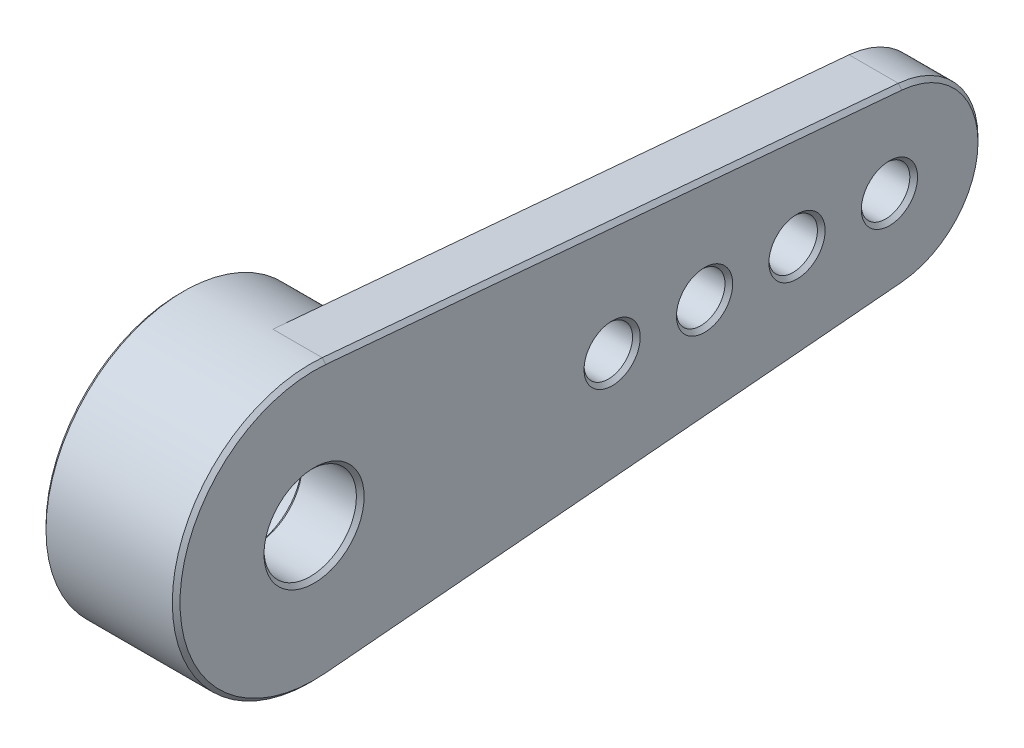
ISO-10303-21;
HEADER;
FILE_DESCRIPTION(('STEP AP214'),'2;1');
FILE_NAME('part.step','',(''),(''),'','','');
FILE_SCHEMA(('AUTOMOTIVE_DESIGN { 1 0 10303 214 1 1 1 1 }'));
ENDSEC;
DATA;
#1=APPLICATION_CONTEXT('core data for automotive mechanical design processes');
#2=APPLICATION_PROTOCOL_DEFINITION('international standard','automotive_design',2000,#1);
#3=PRODUCT_CONTEXT('',#1,'mechanical');
#4=PRODUCT('Part','Part','',(#3));
#5=PRODUCT_RELATED_PRODUCT_CATEGORY('part','',(#4));
#6=PRODUCT_DEFINITION_FORMATION('','',#4);
#7=PRODUCT_DEFINITION_CONTEXT('part definition',#1,'design');
#8=PRODUCT_DEFINITION('design','',#6,#7);
#9=PRODUCT_DEFINITION_SHAPE('','',#8);
#10=(LENGTH_UNIT() NAMED_UNIT(*) SI_UNIT(.MILLI.,.METRE.));
#11=(NAMED_UNIT(*) PLANE_ANGLE_UNIT() SI_UNIT($,.RADIAN.));
#12=(NAMED_UNIT(*) SI_UNIT($,.STERADIAN.) SOLID_ANGLE_UNIT());
#13=UNCERTAINTY_MEASURE_WITH_UNIT(LENGTH_MEASURE(1.E-05),#10,'distance_accuracy_value','');
#14=(GEOMETRIC_REPRESENTATION_CONTEXT(3) GLOBAL_UNCERTAINTY_ASSIGNED_CONTEXT((#13)) GLOBAL_UNIT_ASSIGNED_CONTEXT((#10,
#11,#12)) REPRESENTATION_CONTEXT('',''));
#15=CARTESIAN_POINT('',(0.,0.,0.));
#16=DIRECTION('',(0.,0.,1.));
#17=DIRECTION('',(1.,0.,0.));
#18=AXIS2_PLACEMENT_3D('',#15,#16,#17);
#19=CARTESIAN_POINT('',(0.167920724820396,0.,-7.68182563539887));
#20=DIRECTION('',(1.,0.,0.));
#21=DIRECTION('',(0.,0.,-1.));
#22=AXIS2_PLACEMENT_3D('',#19,#20,#21);
#23=PLANE('',#22);
#24=CARTESIAN_POINT('',(0.167920724820396,0.,-13.5797056353989));
#25=DIRECTION('',(1.,0.,0.));
#26=DIRECTION('',(0.,0.,-1.));
#27=AXIS2_PLACEMENT_3D('',#24,#25,#26);
#28=CIRCLE('',#27,0.556259999999997);
#29=CARTESIAN_POINT('',(0.167920724820396,0.,-14.1359656353989));
#30=VERTEX_POINT('',#29);
#31=EDGE_CURVE('E270',#30,#30,#28,.T.);
#32=ORIENTED_EDGE('',*,*,#31,.T.);
#33=EDGE_LOOP('',(#32));
#34=FACE_BOUND('',#33,.T.);
#35=CARTESIAN_POINT('',(0.167920724820396,0.,-15.4085056353989));
#36=DIRECTION('',(1.,0.,0.));
#37=DIRECTION('',(0.,0.,-1.));
#38=AXIS2_PLACEMENT_3D('',#35,#36,#37);
#39=CIRCLE('',#38,0.556259999999998);
#40=CARTESIAN_POINT('',(0.167920724820396,0.,-15.9647656353989));
#41=VERTEX_POINT('',#40);
#42=EDGE_CURVE('E267',#41,#41,#39,.T.);
#43=ORIENTED_EDGE('',*,*,#42,.T.);
#44=EDGE_LOOP('',(#43));
#45=FACE_BOUND('',#44,.T.);
#46=CARTESIAN_POINT('',(0.167920724820396,0.,-17.2373056353989));
#47=DIRECTION('',(1.,0.,0.));
#48=DIRECTION('',(0.,0.,-1.));
#49=AXIS2_PLACEMENT_3D('',#46,#47,#48);
#50=CIRCLE('',#49,0.556260000000002);
#51=CARTESIAN_POINT('',(0.167920724820396,0.,-17.7935656353989));
#52=VERTEX_POINT('',#51);
#53=EDGE_CURVE('E264',#52,#52,#50,.T.);
#54=ORIENTED_EDGE('',*,*,#53,.T.);
#55=EDGE_LOOP('',(#54));
#56=FACE_BOUND('',#55,.T.);
#57=CARTESIAN_POINT('',(0.167920724820396,0.,-19.0661056353989));
#58=DIRECTION('',(1.,0.,0.));
#59=DIRECTION('',(0.,0.,-1.));
#60=AXIS2_PLACEMENT_3D('',#57,#58,#59);
#61=CIRCLE('',#60,0.556259999999998);
#62=CARTESIAN_POINT('',(0.167920724820396,0.,-19.6223656353989));
#63=VERTEX_POINT('',#62);
#64=EDGE_CURVE('E261',#63,#63,#61,.T.);
#65=ORIENTED_EDGE('',*,*,#64,.T.);
#66=EDGE_LOOP('',(#65));
#67=FACE_BOUND('',#66,.T.);
#68=CARTESIAN_POINT('',(0.167920724820396,0.,-19.1680347194765));
#69=DIRECTION('',(1.,0.,0.));
#70=DIRECTION('',(0.,0.,-1.));
#71=AXIS2_PLACEMENT_3D('',#68,#69,#70);
#72=CIRCLE('',#71,1.6506709159224);
#73=CARTESIAN_POINT('',(0.167920724820396,1.64438961473614,-19.3119001691856));
#74=VERTEX_POINT('',#73);
#75=CARTESIAN_POINT('',(0.167920724820396,-1.64438961473614,-19.3119001691856));
#76=VERTEX_POINT('',#75);
#77=EDGE_CURVE('E215',#74,#76,#72,.F.);
#78=ORIENTED_EDGE('',*,*,#77,.T.);
#79=DIRECTION('',(0.,-0.0871557427476516,0.996194698091746));
#80=VECTOR('',#79,1.);
#81=CARTESIAN_POINT('',(0.167920724820396,-2.64166925261177,-7.91294174778738));
#82=LINE('',#81,#80);
#83=CARTESIAN_POINT('',(0.167920724820396,-2.58586679449233,-8.55076676271532));
#84=VERTEX_POINT('',#83);
#85=EDGE_CURVE('E200',#76,#84,#82,.T.);
#86=ORIENTED_EDGE('',*,*,#85,.T.);
#87=CARTESIAN_POINT('',(0.167920724820396,0.,-7.68182563539887));
#88=DIRECTION('',(-1.,0.,0.));
#89=DIRECTION('',(0.,0.,1.));
#90=AXIS2_PLACEMENT_3D('',#87,#88,#89);
#91=CIRCLE('',#90,2.72796);
#92=CARTESIAN_POINT('',(0.167920724820396,2.58586679449233,-8.55076676271532));
#93=VERTEX_POINT('',#92);
#94=EDGE_CURVE('E224',#93,#84,#91,.T.);
#95=ORIENTED_EDGE('',*,*,#94,.F.);
#96=DIRECTION('',(0.,-0.0871557427476513,-0.996194698091746));
#97=VECTOR('',#96,1.);
#98=CARTESIAN_POINT('',(0.167920724820396,1.64438961473614,-19.3119001691856));
#99=LINE('',#98,#97);
#100=EDGE_CURVE('E219',#93,#74,#99,.T.);
#101=ORIENTED_EDGE('',*,*,#100,.T.);
#102=EDGE_LOOP('',(#78,#86,#95,#101));
#103=FACE_BOUND('',#102,.T.);
#104=ADVANCED_FACE('F35',(#34,#45,#56,#67,#103),#23,.F.);
#105=CARTESIAN_POINT('',(-2.6057592751796,0.,-19.1680347194765));
#106=DIRECTION('',(1.,0.,0.));
#107=DIRECTION('',(0.,0.,-1.));
#108=AXIS2_PLACEMENT_3D('',#105,#106,#107);
#109=CYLINDRICAL_SURFACE('',#108,1.7268709159224);
#110=DIRECTION('',(1.,0.,0.));
#111=VECTOR('',#110,1.);
#112=CARTESIAN_POINT('',(-2.6057592751796,-1.72029965073073,-19.318541436783));
#113=LINE('',#112,#111);
#114=CARTESIAN_POINT('',(0.244120724820395,-1.72029965073073,-19.318541436783));
#115=VERTEX_POINT('',#114);
#116=CARTESIAN_POINT('',(1.2194807248204,-1.72029965073073,-19.318541436783));
#117=VERTEX_POINT('',#116);
#118=EDGE_CURVE('E184',#115,#117,#113,.T.);
#119=ORIENTED_EDGE('',*,*,#118,.F.);
#120=CARTESIAN_POINT('',(0.244120724820395,0.,-19.1680347194765));
#121=DIRECTION('',(1.,0.,0.));
#122=DIRECTION('',(0.,0.,-1.));
#123=AXIS2_PLACEMENT_3D('',#120,#121,#122);
#124=CIRCLE('',#123,1.7268709159224);
#125=CARTESIAN_POINT('',(0.244120724820395,1.72029965073073,-19.318541436783));
#126=VERTEX_POINT('',#125);
#127=EDGE_CURVE('E52',#115,#126,#124,.T.);
#128=ORIENTED_EDGE('',*,*,#127,.T.);
#129=DIRECTION('',(1.,0.,0.));
#130=VECTOR('',#129,1.);
#131=CARTESIAN_POINT('',(-2.6057592751796,1.72029965073073,-19.318541436783));
#132=LINE('',#131,#130);
#133=CARTESIAN_POINT('',(1.2194807248204,1.72029965073073,-19.318541436783));
#134=VERTEX_POINT('',#133);
#135=EDGE_CURVE('E199',#126,#134,#132,.T.);
#136=ORIENTED_EDGE('',*,*,#135,.T.);
#137=CARTESIAN_POINT('',(1.2194807248204,0.,-19.1680347194765));
#138=DIRECTION('',(1.,0.,0.));
#139=DIRECTION('',(0.,0.,-1.));
#140=AXIS2_PLACEMENT_3D('',#137,#138,#139);
#141=CIRCLE('',#140,1.7268709159224);
#142=EDGE_CURVE('E110',#134,#117,#141,.F.);
#143=ORIENTED_EDGE('',*,*,#142,.T.);
#144=EDGE_LOOP('',(#119,#128,#136,#143));
#145=FACE_BOUND('',#144,.T.);
#146=ADVANCED_FACE('F233',(#145),#109,.T.);
#147=CARTESIAN_POINT('',(-2.6057592751796,-2.71757928860636,-7.91958301538475));
#148=DIRECTION('',(0.,-0.996194698091746,-0.0871557427476516));
#149=DIRECTION('',(0.,0.0871557427476516,-0.996194698091746));
#150=AXIS2_PLACEMENT_3D('',#147,#148,#149);
#151=PLANE('',#150);
#152=DIRECTION('',(1.,0.,0.));
#153=VECTOR('',#152,1.);
#154=CARTESIAN_POINT('',(-2.6057592751796,-2.71757928860636,-7.91958301538475));
#155=LINE('',#154,#153);
#156=CARTESIAN_POINT('',(0.244120724820395,-2.71757928860636,-7.91958301538475));
#157=VERTEX_POINT('',#156);
#158=CARTESIAN_POINT('',(1.2194807248204,-2.71757928860636,-7.91958301538475));
#159=VERTEX_POINT('',#158);
#160=EDGE_CURVE('E181',#157,#159,#155,.T.);
#161=ORIENTED_EDGE('',*,*,#160,.F.);
#162=DIRECTION('',(0.,0.0871557427476516,-0.996194698091746));
#163=VECTOR('',#162,1.);
#164=CARTESIAN_POINT('',(0.244120724820395,-1.72029965073073,-19.318541436783));
#165=LINE('',#164,#163);
#166=EDGE_CURVE('E173',#157,#115,#165,.T.);
#167=ORIENTED_EDGE('',*,*,#166,.T.);
#168=ORIENTED_EDGE('',*,*,#118,.T.);
#169=DIRECTION('',(0.,-0.0871557427476516,0.996194698091746));
#170=VECTOR('',#169,1.);
#171=CARTESIAN_POINT('',(1.2194807248204,-2.71757928860636,-7.91958301538475));
#172=LINE('',#171,#170);
#173=EDGE_CURVE('E165',#117,#159,#172,.T.);
#174=ORIENTED_EDGE('',*,*,#173,.T.);
#175=EDGE_LOOP('',(#161,#167,#168,#174));
#176=FACE_BOUND('',#175,.T.);
#177=ADVANCED_FACE('F232',(#176),#151,.T.);
#178=CARTESIAN_POINT('',(-2.6057592751796,0.,-7.68182563539887));
#179=DIRECTION('',(1.,0.,0.));
#180=DIRECTION('',(0.,0.,-1.));
#181=AXIS2_PLACEMENT_3D('',#178,#179,#180);
#182=CYLINDRICAL_SURFACE('',#181,2.72796);
#183=CARTESIAN_POINT('',(-1.2798792751796,0.,-7.68182563539887));
#184=DIRECTION('',(-1.,0.,0.));
#185=DIRECTION('',(0.,0.,1.));
#186=AXIS2_PLACEMENT_3D('',#183,#184,#185);
#187=CIRCLE('',#186,2.72796);
#188=CARTESIAN_POINT('',(-1.2798792751796,0.,-4.95386563539887));
#189=VERTEX_POINT('',#188);
#190=EDGE_CURVE('E240',#189,#189,#187,.F.);
#191=ORIENTED_EDGE('',*,*,#190,.T.);
#192=EDGE_LOOP('',(#191));
#193=FACE_BOUND('',#192,.T.);
#194=ORIENTED_EDGE('',*,*,#94,.T.);
#195=CARTESIAN_POINT('',(-2.48383927517962,0.,-7.68182563539887));
#196=DIRECTION('',(-0.707106781186545,-0.704416026402761,-0.0616284167162148));
#197=DIRECTION('',(0.70710678118655,-0.704416026402757,-0.0616284167162145));
#198=AXIS2_PLACEMENT_3D('',#195,#196,#197);
#199=ELLIPSE('',#198,3.85791802961132,2.72796);
#200=EDGE_CURVE('E44',#84,#157,#199,.T.);
#201=ORIENTED_EDGE('',*,*,#200,.T.);
#202=ORIENTED_EDGE('',*,*,#160,.T.);
#203=CARTESIAN_POINT('',(1.2194807248204,0.,-7.68182563539887));
#204=DIRECTION('',(1.,0.,0.));
#205=DIRECTION('',(0.,0.,-1.));
#206=AXIS2_PLACEMENT_3D('',#203,#204,#205);
#207=CIRCLE('',#206,2.72796);
#208=CARTESIAN_POINT('',(1.2194807248204,2.71757928860636,-7.91958301538475));
#209=VERTEX_POINT('',#208);
#210=EDGE_CURVE('E168',#159,#209,#207,.F.);
#211=ORIENTED_EDGE('',*,*,#210,.T.);
#212=DIRECTION('',(1.,0.,0.));
#213=VECTOR('',#212,1.);
#214=CARTESIAN_POINT('',(-2.6057592751796,2.71757928860636,-7.91958301538475));
#215=LINE('',#214,#213);
#216=CARTESIAN_POINT('',(0.244120724820395,2.71757928860636,-7.91958301538475));
#217=VERTEX_POINT('',#216);
#218=EDGE_CURVE('E185',#217,#209,#215,.T.);
#219=ORIENTED_EDGE('',*,*,#218,.F.);
#220=CARTESIAN_POINT('',(-2.48383927517962,0.,-7.68182563539887));
#221=DIRECTION('',(-0.707106781186546,0.704416026402761,-0.0616284167162147));
#222=DIRECTION('',(0.707106781186549,0.704416026402757,-0.0616284167162144));
#223=AXIS2_PLACEMENT_3D('',#220,#221,#222);
#224=ELLIPSE('',#223,3.85791802961132,2.72796);
#225=EDGE_CURVE('E11',#217,#93,#224,.T.);
#226=ORIENTED_EDGE('',*,*,#225,.T.);
#227=EDGE_LOOP('',(#194,#201,#202,#211,#219,#226));
#228=FACE_BOUND('',#227,.T.);
#229=ADVANCED_FACE('F223',(#193,#228),#182,.T.);
#230=CARTESIAN_POINT('',(-2.6057592751796,1.72029965073073,-19.318541436783));
#231=DIRECTION('',(0.,0.996194698091746,-0.0871557427476513));
#232=DIRECTION('',(0.,0.0871557427476513,0.996194698091746));
#233=AXIS2_PLACEMENT_3D('',#230,#231,#232);
#234=PLANE('',#233);
#235=ORIENTED_EDGE('',*,*,#135,.F.);
#236=DIRECTION('',(0.,0.0871557427476513,0.996194698091746));
#237=VECTOR('',#236,1.);
#238=CARTESIAN_POINT('',(0.244120724820395,2.71757928860636,-7.91958301538475));
#239=LINE('',#238,#237);
#240=EDGE_CURVE('E59',#126,#217,#239,.T.);
#241=ORIENTED_EDGE('',*,*,#240,.T.);
#242=ORIENTED_EDGE('',*,*,#218,.T.);
#243=DIRECTION('',(0.,-0.0871557427476513,-0.996194698091746));
#244=VECTOR('',#243,1.);
#245=CARTESIAN_POINT('',(1.2194807248204,1.72029965073073,-19.318541436783));
#246=LINE('',#245,#244);
#247=EDGE_CURVE('E171',#209,#134,#246,.T.);
#248=ORIENTED_EDGE('',*,*,#247,.T.);
#249=EDGE_LOOP('',(#235,#241,#242,#248));
#250=FACE_BOUND('',#249,.T.);
#251=ADVANCED_FACE('F365',(#250),#234,.T.);
#252=CARTESIAN_POINT('',(1.2956807248204,0.,-19.1680347194765));
#253=DIRECTION('',(1.,0.,0.));
#254=DIRECTION('',(0.,0.,-1.));
#255=AXIS2_PLACEMENT_3D('',#252,#253,#254);
#256=PLANE('',#255);
#257=CARTESIAN_POINT('',(1.2956807248204,0.,-13.5797056353989));
#258=DIRECTION('',(1.,0.,0.));
#259=DIRECTION('',(0.,0.,-1.));
#260=AXIS2_PLACEMENT_3D('',#257,#258,#259);
#261=CIRCLE('',#260,0.556260000000001);
#262=CARTESIAN_POINT('',(1.2956807248204,0.,-14.1359656353989));
#263=VERTEX_POINT('',#262);
#264=EDGE_CURVE('E143',#263,#263,#261,.F.);
#265=ORIENTED_EDGE('',*,*,#264,.T.);
#266=EDGE_LOOP('',(#265));
#267=FACE_BOUND('',#266,.T.);
#268=CARTESIAN_POINT('',(1.2956807248204,0.,-15.4085056353989));
#269=DIRECTION('',(1.,0.,0.));
#270=DIRECTION('',(0.,0.,-1.));
#271=AXIS2_PLACEMENT_3D('',#268,#269,#270);
#272=CIRCLE('',#271,0.556260000000002);
#273=CARTESIAN_POINT('',(1.2956807248204,0.,-15.9647656353989));
#274=VERTEX_POINT('',#273);
#275=EDGE_CURVE('E140',#274,#274,#272,.F.);
#276=ORIENTED_EDGE('',*,*,#275,.T.);
#277=EDGE_LOOP('',(#276));
#278=FACE_BOUND('',#277,.T.);
#279=CARTESIAN_POINT('',(1.2956807248204,0.,-17.2373056353989));
#280=DIRECTION('',(1.,0.,0.));
#281=DIRECTION('',(0.,0.,-1.));
#282=AXIS2_PLACEMENT_3D('',#279,#280,#281);
#283=CIRCLE('',#282,0.556260000000004);
#284=CARTESIAN_POINT('',(1.2956807248204,0.,-17.7935656353989));
#285=VERTEX_POINT('',#284);
#286=EDGE_CURVE('E133',#285,#285,#283,.F.);
#287=ORIENTED_EDGE('',*,*,#286,.T.);
#288=EDGE_LOOP('',(#287));
#289=FACE_BOUND('',#288,.T.);
#290=CARTESIAN_POINT('',(1.2956807248204,0.,-19.0661056353989));
#291=DIRECTION('',(1.,0.,0.));
#292=DIRECTION('',(0.,0.,-1.));
#293=AXIS2_PLACEMENT_3D('',#290,#291,#292);
#294=CIRCLE('',#293,0.556260000000002);
#295=CARTESIAN_POINT('',(1.2956807248204,0.,-19.6223656353989));
#296=VERTEX_POINT('',#295);
#297=EDGE_CURVE('E130',#296,#296,#294,.F.);
#298=ORIENTED_EDGE('',*,*,#297,.T.);
#299=EDGE_LOOP('',(#298));
#300=FACE_BOUND('',#299,.T.);
#301=DIRECTION('',(0.,0.0871557427476516,-0.996194698091746));
#302=VECTOR('',#301,1.);
#303=CARTESIAN_POINT('',(1.2956807248204,-1.64438961473614,-19.3119001691856));
#304=LINE('',#303,#302);
#305=CARTESIAN_POINT('',(1.2956807248204,-2.64166925261177,-7.91294174778738));
#306=VERTEX_POINT('',#305);
#307=CARTESIAN_POINT('',(1.2956807248204,-1.64438961473614,-19.3119001691856));
#308=VERTEX_POINT('',#307);
#309=EDGE_CURVE('E128',#306,#308,#304,.T.);
#310=ORIENTED_EDGE('',*,*,#309,.T.);
#311=CARTESIAN_POINT('',(1.2956807248204,0.,-19.1680347194765));
#312=DIRECTION('',(1.,0.,0.));
#313=DIRECTION('',(0.,0.,-1.));
#314=AXIS2_PLACEMENT_3D('',#311,#312,#313);
#315=CIRCLE('',#314,1.6506709159224);
#316=CARTESIAN_POINT('',(1.2956807248204,1.64438961473614,-19.3119001691856));
#317=VERTEX_POINT('',#316);
#318=EDGE_CURVE('E108',#308,#317,#315,.T.);
#319=ORIENTED_EDGE('',*,*,#318,.T.);
#320=DIRECTION('',(0.,0.0871557427476513,0.996194698091746));
#321=VECTOR('',#320,1.);
#322=CARTESIAN_POINT('',(1.2956807248204,1.64438961473614,-19.3119001691856));
#323=LINE('',#322,#321);
#324=CARTESIAN_POINT('',(1.2956807248204,2.64166925261177,-7.91294174778738));
#325=VERTEX_POINT('',#324);
#326=EDGE_CURVE('E116',#317,#325,#323,.T.);
#327=ORIENTED_EDGE('',*,*,#326,.T.);
#328=CARTESIAN_POINT('',(1.2956807248204,0.,-7.68182563539887));
#329=DIRECTION('',(1.,0.,0.));
#330=DIRECTION('',(0.,0.,-1.));
#331=AXIS2_PLACEMENT_3D('',#328,#329,#330);
#332=CIRCLE('',#331,2.65176);
#333=EDGE_CURVE('E122',#325,#306,#332,.T.);
#334=ORIENTED_EDGE('',*,*,#333,.T.);
#335=EDGE_LOOP('',(#310,#319,#327,#334));
#336=FACE_BOUND('',#335,.T.);
#337=CARTESIAN_POINT('',(1.2956807248204,0.,-7.68182563539887));
#338=DIRECTION('',(1.,0.,0.));
#339=DIRECTION('',(0.,0.,-1.));
#340=AXIS2_PLACEMENT_3D('',#337,#338,#339);
#341=CIRCLE('',#340,0.9906);
#342=CARTESIAN_POINT('',(1.2956807248204,0.,-8.67242563539887));
#343=VERTEX_POINT('',#342);
#344=EDGE_CURVE('E258',#343,#343,#341,.F.);
#345=ORIENTED_EDGE('',*,*,#344,.T.);
#346=EDGE_LOOP('',(#345));
#347=FACE_BOUND('',#346,.T.);
#348=ADVANCED_FACE('F125',(#267,#278,#289,#300,#336,#347),#256,.T.);
#349=CARTESIAN_POINT('',(-1.72870936794941,0.,-17.2373056353989));
#350=DIRECTION('',(1.,0.,0.));
#351=DIRECTION('',(0.,0.,-1.));
#352=AXIS2_PLACEMENT_3D('',#349,#350,#351);
#353=CYLINDRICAL_SURFACE('',#352,0.48006);
#354=CARTESIAN_POINT('',(1.21948072482039,0.,-17.2373056353989));
#355=DIRECTION('',(1.,0.,0.));
#356=DIRECTION('',(0.,0.,-1.));
#357=AXIS2_PLACEMENT_3D('',#354,#355,#356);
#358=CIRCLE('',#357,0.48006);
#359=CARTESIAN_POINT('',(1.21948072482039,0.,-17.7173656353989));
#360=VERTEX_POINT('',#359);
#361=EDGE_CURVE('E155',#360,#360,#358,.T.);
#362=ORIENTED_EDGE('',*,*,#361,.T.);
#363=EDGE_LOOP('',(#362));
#364=FACE_BOUND('',#363,.T.);
#365=CARTESIAN_POINT('',(0.244120724820397,0.,-17.2373056353989));
#366=DIRECTION('',(1.,0.,0.));
#367=DIRECTION('',(0.,0.,-1.));
#368=AXIS2_PLACEMENT_3D('',#365,#366,#367);
#369=CIRCLE('',#368,0.48006);
#370=CARTESIAN_POINT('',(0.244120724820397,0.,-17.7173656353989));
#371=VERTEX_POINT('',#370);
#372=EDGE_CURVE('E152',#371,#371,#369,.F.);
#373=ORIENTED_EDGE('',*,*,#372,.T.);
#374=EDGE_LOOP('',(#373));
#375=FACE_BOUND('',#374,.T.);
#376=ADVANCED_FACE('F371',(#364,#375),#353,.F.);
#377=CARTESIAN_POINT('',(-1.3560792751796,0.,-7.68182563539887));
#378=DIRECTION('',(-1.,0.,0.));
#379=DIRECTION('',(0.,0.,1.));
#380=AXIS2_PLACEMENT_3D('',#377,#378,#379);
#381=PLANE('',#380);
#382=CARTESIAN_POINT('',(-1.3560792751796,0.,-7.68182563539887));
#383=DIRECTION('',(-1.,0.,0.));
#384=DIRECTION('',(0.,0.,1.));
#385=AXIS2_PLACEMENT_3D('',#382,#383,#384);
#386=CIRCLE('',#385,2.65176);
#387=CARTESIAN_POINT('',(-1.3560792751796,0.,-5.03006563539887));
#388=VERTEX_POINT('',#387);
#389=EDGE_CURVE('E236',#388,#388,#386,.T.);
#390=ORIENTED_EDGE('',*,*,#389,.T.);
#391=EDGE_LOOP('',(#390));
#392=FACE_BOUND('',#391,.T.);
#393=CARTESIAN_POINT('',(-1.3560792751796,0.,-7.68182563539887));
#394=DIRECTION('',(-1.,0.,0.));
#395=DIRECTION('',(0.,0.,1.));
#396=AXIS2_PLACEMENT_3D('',#393,#394,#395);
#397=CIRCLE('',#396,1.79832);
#398=CARTESIAN_POINT('',(-1.3560792751796,0.,-5.88350563539887));
#399=VERTEX_POINT('',#398);
#400=EDGE_CURVE('E194',#399,#399,#397,.F.);
#401=ORIENTED_EDGE('',*,*,#400,.T.);
#402=EDGE_LOOP('',(#401));
#403=FACE_BOUND('',#402,.T.);
#404=ADVANCED_FACE('F381',(#392,#403),#381,.T.);
#405=CARTESIAN_POINT('',(0.0688607248203956,0.,-7.68182563539887));
#406=DIRECTION('',(-1.,0.,0.));
#407=DIRECTION('',(0.,0.,1.));
#408=AXIS2_PLACEMENT_3D('',#405,#406,#407);
#409=CYLINDRICAL_SURFACE('',#408,1.72212);
#410=CARTESIAN_POINT('',(-1.27987927517961,0.,-7.68182563539887));
#411=DIRECTION('',(-1.,0.,0.));
#412=DIRECTION('',(0.,0.,1.));
#413=AXIS2_PLACEMENT_3D('',#410,#411,#412);
#414=CIRCLE('',#413,1.72212);
#415=CARTESIAN_POINT('',(-1.27987927517961,0.,-5.95970563539887));
#416=VERTEX_POINT('',#415);
#417=EDGE_CURVE('E244',#416,#416,#414,.T.);
#418=ORIENTED_EDGE('',*,*,#417,.T.);
#419=EDGE_LOOP('',(#418));
#420=FACE_BOUND('',#419,.T.);
#421=CARTESIAN_POINT('',(0.0688607248203956,0.,-7.68182563539887));
#422=DIRECTION('',(-1.,0.,0.));
#423=DIRECTION('',(0.,0.,1.));
#424=AXIS2_PLACEMENT_3D('',#421,#422,#423);
#425=CIRCLE('',#424,1.72212);
#426=CARTESIAN_POINT('',(0.0688607248203956,0.,-5.95970563539887));
#427=VERTEX_POINT('',#426);
#428=EDGE_CURVE('E180',#427,#427,#425,.T.);
#429=ORIENTED_EDGE('',*,*,#428,.F.);
#430=EDGE_LOOP('',(#429));
#431=FACE_BOUND('',#430,.T.);
#432=ADVANCED_FACE('F385',(#420,#431),#409,.F.);
#433=CARTESIAN_POINT('',(0.0688607248203956,0.,-7.68182563539887));
#434=DIRECTION('',(-1.,0.,0.));
#435=DIRECTION('',(0.,0.,1.));
#436=AXIS2_PLACEMENT_3D('',#433,#434,#435);
#437=PLANE('',#436);
#438=CARTESIAN_POINT('',(0.0688607248203956,0.,-7.68182563539887));
#439=DIRECTION('',(-1.,0.,0.));
#440=DIRECTION('',(0.,0.,1.));
#441=AXIS2_PLACEMENT_3D('',#438,#439,#440);
#442=CIRCLE('',#441,0.9906);
#443=CARTESIAN_POINT('',(0.0688607248203956,0.,-6.69122563539887));
#444=VERTEX_POINT('',#443);
#445=EDGE_CURVE('E255',#444,#444,#442,.F.);
#446=ORIENTED_EDGE('',*,*,#445,.T.);
#447=EDGE_LOOP('',(#446));
#448=FACE_BOUND('',#447,.T.);
#449=ORIENTED_EDGE('',*,*,#428,.T.);
#450=EDGE_LOOP('',(#449));
#451=FACE_BOUND('',#450,.T.);
#452=ADVANCED_FACE('F388',(#448,#451),#437,.T.);
#453=CARTESIAN_POINT('',(1.2956957248204,0.,-7.68182563539887));
#454=DIRECTION('',(-1.,0.,0.));
#455=DIRECTION('',(0.,0.,1.));
#456=AXIS2_PLACEMENT_3D('',#453,#454,#455);
#457=CYLINDRICAL_SURFACE('',#456,0.9144);
#458=CARTESIAN_POINT('',(0.145060724820394,0.,-7.68182563539887));
#459=DIRECTION('',(-1.,0.,0.));
#460=DIRECTION('',(0.,0.,1.));
#461=AXIS2_PLACEMENT_3D('',#458,#459,#460);
#462=CIRCLE('',#461,0.9144);
#463=CARTESIAN_POINT('',(0.145060724820394,0.,-6.76742563539887));
#464=VERTEX_POINT('',#463);
#465=EDGE_CURVE('E252',#464,#464,#462,.T.);
#466=ORIENTED_EDGE('',*,*,#465,.T.);
#467=EDGE_LOOP('',(#466));
#468=FACE_BOUND('',#467,.T.);
#469=CARTESIAN_POINT('',(1.21948072482039,0.,-7.68182563539887));
#470=DIRECTION('',(1.,0.,0.));
#471=DIRECTION('',(0.,0.,-1.));
#472=AXIS2_PLACEMENT_3D('',#469,#470,#471);
#473=CIRCLE('',#472,0.9144);
#474=CARTESIAN_POINT('',(1.21948072482039,0.,-8.59622563539887));
#475=VERTEX_POINT('',#474);
#476=EDGE_CURVE('E249',#475,#475,#473,.T.);
#477=ORIENTED_EDGE('',*,*,#476,.T.);
#478=EDGE_LOOP('',(#477));
#479=FACE_BOUND('',#478,.T.);
#480=ADVANCED_FACE('F392',(#468,#479),#457,.F.);
#481=CARTESIAN_POINT('',(-1.3560792751796,0.,-15.4085056353989));
#482=DIRECTION('',(1.,0.,0.));
#483=DIRECTION('',(0.,0.,-1.));
#484=AXIS2_PLACEMENT_3D('',#481,#482,#483);
#485=CYLINDRICAL_SURFACE('',#484,0.48006);
#486=CARTESIAN_POINT('',(0.244120724820393,0.,-15.4085056353989));
#487=DIRECTION('',(1.,0.,0.));
#488=DIRECTION('',(0.,0.,-1.));
#489=AXIS2_PLACEMENT_3D('',#486,#487,#488);
#490=CIRCLE('',#489,0.48006);
#491=CARTESIAN_POINT('',(0.244120724820393,0.,-15.8885656353989));
#492=VERTEX_POINT('',#491);
#493=EDGE_CURVE('E149',#492,#492,#490,.F.);
#494=ORIENTED_EDGE('',*,*,#493,.T.);
#495=EDGE_LOOP('',(#494));
#496=FACE_BOUND('',#495,.T.);
#497=CARTESIAN_POINT('',(1.21948072482039,0.,-15.4085056353989));
#498=DIRECTION('',(1.,0.,0.));
#499=DIRECTION('',(0.,0.,-1.));
#500=AXIS2_PLACEMENT_3D('',#497,#498,#499);
#501=CIRCLE('',#500,0.48006);
#502=CARTESIAN_POINT('',(1.21948072482039,0.,-15.8885656353989));
#503=VERTEX_POINT('',#502);
#504=EDGE_CURVE('E146',#503,#503,#501,.T.);
#505=ORIENTED_EDGE('',*,*,#504,.T.);
#506=EDGE_LOOP('',(#505));
#507=FACE_BOUND('',#506,.T.);
#508=ADVANCED_FACE('F396',(#496,#507),#485,.F.);
#509=CARTESIAN_POINT('',(-1.3560792751796,0.,-13.5797056353989));
#510=DIRECTION('',(1.,0.,0.));
#511=DIRECTION('',(0.,0.,-1.));
#512=AXIS2_PLACEMENT_3D('',#509,#510,#511);
#513=CYLINDRICAL_SURFACE('',#512,0.480059999999999);
#514=CARTESIAN_POINT('',(0.244120724820394,0.,-13.5797056353989));
#515=DIRECTION('',(1.,0.,0.));
#516=DIRECTION('',(0.,0.,-1.));
#517=AXIS2_PLACEMENT_3D('',#514,#515,#516);
#518=CIRCLE('',#517,0.480059999999999);
#519=CARTESIAN_POINT('',(0.244120724820394,0.,-14.0597656353989));
#520=VERTEX_POINT('',#519);
#521=EDGE_CURVE('E123',#520,#520,#518,.F.);
#522=ORIENTED_EDGE('',*,*,#521,.T.);
#523=EDGE_LOOP('',(#522));
#524=FACE_BOUND('',#523,.T.);
#525=CARTESIAN_POINT('',(1.21948072482039,0.,-13.5797056353989));
#526=DIRECTION('',(1.,0.,0.));
#527=DIRECTION('',(0.,0.,-1.));
#528=AXIS2_PLACEMENT_3D('',#525,#526,#527);
#529=CIRCLE('',#528,0.480059999999999);
#530=CARTESIAN_POINT('',(1.21948072482039,0.,-14.0597656353989));
#531=VERTEX_POINT('',#530);
#532=EDGE_CURVE('E273',#531,#531,#529,.T.);
#533=ORIENTED_EDGE('',*,*,#532,.T.);
#534=EDGE_LOOP('',(#533));
#535=FACE_BOUND('',#534,.T.);
#536=ADVANCED_FACE('F400',(#524,#535),#513,.F.);
#537=CARTESIAN_POINT('',(-1.3560792751796,0.,-19.0661056353989));
#538=DIRECTION('',(1.,0.,0.));
#539=DIRECTION('',(0.,0.,-1.));
#540=AXIS2_PLACEMENT_3D('',#537,#538,#539);
#541=CYLINDRICAL_SURFACE('',#540,0.48006);
#542=CARTESIAN_POINT('',(0.244120724820393,0.,-19.0661056353989));
#543=DIRECTION('',(1.,0.,0.));
#544=DIRECTION('',(0.,0.,-1.));
#545=AXIS2_PLACEMENT_3D('',#542,#543,#544);
#546=CIRCLE('',#545,0.48006);
#547=CARTESIAN_POINT('',(0.244120724820393,0.,-19.5461656353989));
#548=VERTEX_POINT('',#547);
#549=EDGE_CURVE('E161',#548,#548,#546,.F.);
#550=ORIENTED_EDGE('',*,*,#549,.T.);
#551=EDGE_LOOP('',(#550));
#552=FACE_BOUND('',#551,.T.);
#553=CARTESIAN_POINT('',(1.21948072482039,0.,-19.0661056353989));
#554=DIRECTION('',(1.,0.,0.));
#555=DIRECTION('',(0.,0.,-1.));
#556=AXIS2_PLACEMENT_3D('',#553,#554,#555);
#557=CIRCLE('',#556,0.48006);
#558=CARTESIAN_POINT('',(1.21948072482039,0.,-19.5461656353989));
#559=VERTEX_POINT('',#558);
#560=EDGE_CURVE('E158',#559,#559,#557,.T.);
#561=ORIENTED_EDGE('',*,*,#560,.T.);
#562=EDGE_LOOP('',(#561));
#563=FACE_BOUND('',#562,.T.);
#564=ADVANCED_FACE('F307',(#552,#563),#541,.F.);
#565=CARTESIAN_POINT('',(-1.3560792751796,0.,-7.68182563539887));
#566=DIRECTION('',(1.,0.,0.));
#567=DIRECTION('',(0.,0.,-1.));
#568=AXIS2_PLACEMENT_3D('',#565,#566,#567);
#569=CONICAL_SURFACE('',#568,2.65176,0.785398163397445);
#570=ORIENTED_EDGE('',*,*,#190,.F.);
#571=EDGE_LOOP('',(#570));
#572=FACE_BOUND('',#571,.T.);
#573=ORIENTED_EDGE('',*,*,#389,.F.);
#574=EDGE_LOOP('',(#573));
#575=FACE_BOUND('',#574,.T.);
#576=ADVANCED_FACE('F303',(#572,#575),#569,.T.);
#577=CARTESIAN_POINT('',(-1.27987927517961,0.,-7.68182563539887));
#578=DIRECTION('',(-1.,0.,0.));
#579=DIRECTION('',(0.,0.,1.));
#580=AXIS2_PLACEMENT_3D('',#577,#578,#579);
#581=CONICAL_SURFACE('',#580,1.72212,0.785398163397452);
#582=ORIENTED_EDGE('',*,*,#400,.F.);
#583=EDGE_LOOP('',(#582));
#584=FACE_BOUND('',#583,.T.);
#585=ORIENTED_EDGE('',*,*,#417,.F.);
#586=EDGE_LOOP('',(#585));
#587=FACE_BOUND('',#586,.T.);
#588=ADVANCED_FACE('F306',(#584,#587),#581,.F.);
#589=CARTESIAN_POINT('',(0.145060724820394,0.,-7.68182563539887));
#590=DIRECTION('',(-1.,0.,0.));
#591=DIRECTION('',(0.,0.,1.));
#592=AXIS2_PLACEMENT_3D('',#589,#590,#591);
#593=CONICAL_SURFACE('',#592,0.9144,0.785398163397454);
#594=ORIENTED_EDGE('',*,*,#445,.F.);
#595=EDGE_LOOP('',(#594));
#596=FACE_BOUND('',#595,.T.);
#597=ORIENTED_EDGE('',*,*,#465,.F.);
#598=EDGE_LOOP('',(#597));
#599=FACE_BOUND('',#598,.T.);
#600=ADVANCED_FACE('F311',(#596,#599),#593,.F.);
#601=CARTESIAN_POINT('',(1.21948072482039,0.,-7.68182563539887));
#602=DIRECTION('',(1.,0.,0.));
#603=DIRECTION('',(0.,0.,-1.));
#604=AXIS2_PLACEMENT_3D('',#601,#602,#603);
#605=CONICAL_SURFACE('',#604,0.9144,0.785398163397441);
#606=ORIENTED_EDGE('',*,*,#344,.F.);
#607=EDGE_LOOP('',(#606));
#608=FACE_BOUND('',#607,.T.);
#609=ORIENTED_EDGE('',*,*,#476,.F.);
#610=EDGE_LOOP('',(#609));
#611=FACE_BOUND('',#610,.T.);
#612=ADVANCED_FACE('F315',(#608,#611),#605,.F.);
#613=CARTESIAN_POINT('',(0.167920724820396,0.,-13.5797056353989));
#614=DIRECTION('',(-1.,0.,0.));
#615=DIRECTION('',(0.,0.,1.));
#616=AXIS2_PLACEMENT_3D('',#613,#614,#615);
#617=CONICAL_SURFACE('',#616,0.556259999999998,0.785398163397451);
#618=ORIENTED_EDGE('',*,*,#521,.F.);
#619=EDGE_LOOP('',(#618));
#620=FACE_BOUND('',#619,.T.);
#621=ORIENTED_EDGE('',*,*,#31,.F.);
#622=EDGE_LOOP('',(#621));
#623=FACE_BOUND('',#622,.T.);
#624=ADVANCED_FACE('F319',(#620,#623),#617,.F.);
#625=CARTESIAN_POINT('',(1.21948072482039,0.,-13.5797056353989));
#626=DIRECTION('',(1.,0.,0.));
#627=DIRECTION('',(0.,0.,-1.));
#628=AXIS2_PLACEMENT_3D('',#625,#626,#627);
#629=CONICAL_SURFACE('',#628,0.480059999999999,0.78539816339745);
#630=ORIENTED_EDGE('',*,*,#264,.F.);
#631=EDGE_LOOP('',(#630));
#632=FACE_BOUND('',#631,.T.);
#633=ORIENTED_EDGE('',*,*,#532,.F.);
#634=EDGE_LOOP('',(#633));
#635=FACE_BOUND('',#634,.T.);
#636=ADVANCED_FACE('F323',(#632,#635),#629,.F.);
#637=CARTESIAN_POINT('',(0.167920724820396,0.,-15.4085056353989));
#638=DIRECTION('',(-1.,0.,0.));
#639=DIRECTION('',(0.,0.,1.));
#640=AXIS2_PLACEMENT_3D('',#637,#638,#639);
#641=CONICAL_SURFACE('',#640,0.556259999999998,0.785398163397451);
#642=ORIENTED_EDGE('',*,*,#493,.F.);
#643=EDGE_LOOP('',(#642));
#644=FACE_BOUND('',#643,.T.);
#645=ORIENTED_EDGE('',*,*,#42,.F.);
#646=EDGE_LOOP('',(#645));
#647=FACE_BOUND('',#646,.T.);
#648=ADVANCED_FACE('F327',(#644,#647),#641,.F.);
#649=CARTESIAN_POINT('',(1.21948072482039,0.,-15.4085056353989));
#650=DIRECTION('',(1.,0.,0.));
#651=DIRECTION('',(0.,0.,-1.));
#652=AXIS2_PLACEMENT_3D('',#649,#650,#651);
#653=CONICAL_SURFACE('',#652,0.48006,0.78539816339745);
#654=ORIENTED_EDGE('',*,*,#275,.F.);
#655=EDGE_LOOP('',(#654));
#656=FACE_BOUND('',#655,.T.);
#657=ORIENTED_EDGE('',*,*,#504,.F.);
#658=EDGE_LOOP('',(#657));
#659=FACE_BOUND('',#658,.T.);
#660=ADVANCED_FACE('F331',(#656,#659),#653,.F.);
#661=CARTESIAN_POINT('',(1.21948072482039,0.,-17.2373056353989));
#662=DIRECTION('',(1.,0.,0.));
#663=DIRECTION('',(0.,0.,-1.));
#664=AXIS2_PLACEMENT_3D('',#661,#662,#663);
#665=CONICAL_SURFACE('',#664,0.48006,0.785398163397453);
#666=ORIENTED_EDGE('',*,*,#286,.F.);
#667=EDGE_LOOP('',(#666));
#668=FACE_BOUND('',#667,.T.);
#669=ORIENTED_EDGE('',*,*,#361,.F.);
#670=EDGE_LOOP('',(#669));
#671=FACE_BOUND('',#670,.T.);
#672=ADVANCED_FACE('F335',(#668,#671),#665,.F.);
#673=CARTESIAN_POINT('',(0.244120724820397,0.,-17.2373056353989));
#674=DIRECTION('',(-1.,0.,0.));
#675=DIRECTION('',(0.,0.,1.));
#676=AXIS2_PLACEMENT_3D('',#673,#674,#675);
#677=CONICAL_SURFACE('',#676,0.48006,0.785398163397451);
#678=ORIENTED_EDGE('',*,*,#53,.F.);
#679=EDGE_LOOP('',(#678));
#680=FACE_BOUND('',#679,.T.);
#681=ORIENTED_EDGE('',*,*,#372,.F.);
#682=EDGE_LOOP('',(#681));
#683=FACE_BOUND('',#682,.T.);
#684=ADVANCED_FACE('F339',(#680,#683),#677,.F.);
#685=CARTESIAN_POINT('',(0.167920724820396,0.,-19.0661056353989));
#686=DIRECTION('',(-1.,0.,0.));
#687=DIRECTION('',(0.,0.,1.));
#688=AXIS2_PLACEMENT_3D('',#685,#686,#687);
#689=CONICAL_SURFACE('',#688,0.556259999999998,0.785398163397451);
#690=ORIENTED_EDGE('',*,*,#549,.F.);
#691=EDGE_LOOP('',(#690));
#692=FACE_BOUND('',#691,.T.);
#693=ORIENTED_EDGE('',*,*,#64,.F.);
#694=EDGE_LOOP('',(#693));
#695=FACE_BOUND('',#694,.T.);
#696=ADVANCED_FACE('F343',(#692,#695),#689,.F.);
#697=CARTESIAN_POINT('',(1.21948072482039,0.,-19.0661056353989));
#698=DIRECTION('',(1.,0.,0.));
#699=DIRECTION('',(0.,0.,-1.));
#700=AXIS2_PLACEMENT_3D('',#697,#698,#699);
#701=CONICAL_SURFACE('',#700,0.48006,0.78539816339745);
#702=ORIENTED_EDGE('',*,*,#297,.F.);
#703=EDGE_LOOP('',(#702));
#704=FACE_BOUND('',#703,.T.);
#705=ORIENTED_EDGE('',*,*,#560,.F.);
#706=EDGE_LOOP('',(#705));
#707=FACE_BOUND('',#706,.T.);
#708=ADVANCED_FACE('F291',(#704,#707),#701,.F.);
#709=CARTESIAN_POINT('',(1.2956807248204,0.,-7.68182563539887));
#710=DIRECTION('',(-1.,0.,0.));
#711=DIRECTION('',(0.,0.,1.));
#712=AXIS2_PLACEMENT_3D('',#709,#710,#711);
#713=CONICAL_SURFACE('',#712,2.65176,0.785398163397452);
#714=DIRECTION('',(0.707106781186545,-0.704416026402762,0.0616284167162143));
#715=VECTOR('',#714,1.);
#716=CARTESIAN_POINT('',(1.2194807248204,2.71757928860636,-7.91958301538475));
#717=LINE('',#716,#715);
#718=EDGE_CURVE('E119',#209,#325,#717,.T.);
#719=ORIENTED_EDGE('',*,*,#718,.F.);
#720=ORIENTED_EDGE('',*,*,#210,.F.);
#721=DIRECTION('',(-0.707106781186548,-0.704416026402759,-0.0616284167162145));
#722=VECTOR('',#721,1.);
#723=CARTESIAN_POINT('',(1.2956807248204,-2.64166925261177,-7.91294174778738));
#724=LINE('',#723,#722);
#725=EDGE_CURVE('E177',#306,#159,#724,.T.);
#726=ORIENTED_EDGE('',*,*,#725,.F.);
#727=ORIENTED_EDGE('',*,*,#333,.F.);
#728=EDGE_LOOP('',(#719,#720,#726,#727));
#729=FACE_BOUND('',#728,.T.);
#730=ADVANCED_FACE('F280',(#729),#713,.T.);
#731=CARTESIAN_POINT('',(1.2956807248204,-1.64438961473614,-19.3119001691856));
#732=DIRECTION('',(-0.707106781186548,0.704416026402758,0.0616284167162146));
#733=DIRECTION('',(0.,0.0871557427476516,-0.996194698091746));
#734=AXIS2_PLACEMENT_3D('',#731,#732,#733);
#735=PLANE('',#734);
#736=ORIENTED_EDGE('',*,*,#725,.T.);
#737=ORIENTED_EDGE('',*,*,#173,.F.);
#738=DIRECTION('',(-0.707106781186547,-0.70441602640276,-0.0616284167162144));
#739=VECTOR('',#738,1.);
#740=CARTESIAN_POINT('',(1.2956807248204,-1.64438961473614,-19.3119001691856));
#741=LINE('',#740,#739);
#742=EDGE_CURVE('E113',#308,#117,#741,.T.);
#743=ORIENTED_EDGE('',*,*,#742,.F.);
#744=ORIENTED_EDGE('',*,*,#309,.F.);
#745=EDGE_LOOP('',(#736,#737,#743,#744));
#746=FACE_BOUND('',#745,.T.);
#747=ADVANCED_FACE('F283',(#746),#735,.F.);
#748=CARTESIAN_POINT('',(1.2956807248204,1.64438961473614,-19.3119001691856));
#749=DIRECTION('',(-0.707106781186549,-0.704416026402758,0.0616284167162144));
#750=DIRECTION('',(0.,0.0871557427476513,0.996194698091746));
#751=AXIS2_PLACEMENT_3D('',#748,#749,#750);
#752=PLANE('',#751);
#753=ORIENTED_EDGE('',*,*,#718,.T.);
#754=ORIENTED_EDGE('',*,*,#326,.F.);
#755=DIRECTION('',(0.707106781186549,-0.704416026402758,0.0616284167162146));
#756=VECTOR('',#755,1.);
#757=CARTESIAN_POINT('',(1.2194807248204,1.72029965073073,-19.318541436783));
#758=LINE('',#757,#756);
#759=EDGE_CURVE('E103',#134,#317,#758,.T.);
#760=ORIENTED_EDGE('',*,*,#759,.F.);
#761=ORIENTED_EDGE('',*,*,#247,.F.);
#762=EDGE_LOOP('',(#753,#754,#760,#761));
#763=FACE_BOUND('',#762,.T.);
#764=ADVANCED_FACE('F117',(#763),#752,.F.);
#765=CARTESIAN_POINT('',(1.2956807248204,0.,-19.1680347194765));
#766=DIRECTION('',(-1.,0.,0.));
#767=DIRECTION('',(0.,0.,1.));
#768=AXIS2_PLACEMENT_3D('',#765,#766,#767);
#769=CONICAL_SURFACE('',#768,1.6506709159224,0.78539816339745);
#770=ORIENTED_EDGE('',*,*,#742,.T.);
#771=ORIENTED_EDGE('',*,*,#142,.F.);
#772=ORIENTED_EDGE('',*,*,#759,.T.);
#773=ORIENTED_EDGE('',*,*,#318,.F.);
#774=EDGE_LOOP('',(#770,#771,#772,#773));
#775=FACE_BOUND('',#774,.T.);
#776=ADVANCED_FACE('F106',(#775),#769,.T.);
#777=CARTESIAN_POINT('',(0.244120724820395,1.72029965073073,-19.318541436783));
#778=DIRECTION('',(-0.707106781186546,0.704416026402761,-0.0616284167162147));
#779=DIRECTION('',(0.,-0.0871557427476513,-0.996194698091746));
#780=AXIS2_PLACEMENT_3D('',#777,#778,#779);
#781=PLANE('',#780);
#782=ORIENTED_EDGE('',*,*,#225,.F.);
#783=ORIENTED_EDGE('',*,*,#240,.F.);
#784=DIRECTION('',(0.707106781186548,0.704416026402758,-0.0616284167162144));
#785=VECTOR('',#784,1.);
#786=CARTESIAN_POINT('',(0.167920724820396,1.64438961473614,-19.3119001691856));
#787=LINE('',#786,#785);
#788=EDGE_CURVE('E39',#74,#126,#787,.T.);
#789=ORIENTED_EDGE('',*,*,#788,.F.);
#790=ORIENTED_EDGE('',*,*,#100,.F.);
#791=EDGE_LOOP('',(#782,#783,#789,#790));
#792=FACE_BOUND('',#791,.T.);
#793=ADVANCED_FACE('F37',(#792),#781,.T.);
#794=CARTESIAN_POINT('',(0.244120724820395,0.,-19.1680347194765));
#795=DIRECTION('',(1.,0.,0.));
#796=DIRECTION('',(0.,0.,-1.));
#797=AXIS2_PLACEMENT_3D('',#794,#795,#796);
#798=CONICAL_SURFACE('',#797,1.7268709159224,0.785398163397447);
#799=ORIENTED_EDGE('',*,*,#788,.T.);
#800=ORIENTED_EDGE('',*,*,#127,.F.);
#801=DIRECTION('',(0.707106781186552,-0.704416026402754,-0.0616284167162147));
#802=VECTOR('',#801,1.);
#803=CARTESIAN_POINT('',(0.167920724820396,-1.64438961473614,-19.3119001691856));
#804=LINE('',#803,#802);
#805=EDGE_CURVE('E204',#76,#115,#804,.T.);
#806=ORIENTED_EDGE('',*,*,#805,.F.);
#807=ORIENTED_EDGE('',*,*,#77,.F.);
#808=EDGE_LOOP('',(#799,#800,#806,#807));
#809=FACE_BOUND('',#808,.T.);
#810=ADVANCED_FACE('F213',(#809),#798,.T.);
#811=CARTESIAN_POINT('',(0.244120724820395,-2.71757928860636,-7.91958301538475));
#812=DIRECTION('',(-0.707106781186545,-0.704416026402761,-0.0616284167162148));
#813=DIRECTION('',(0.,-0.0871557427476516,0.996194698091746));
#814=AXIS2_PLACEMENT_3D('',#811,#812,#813);
#815=PLANE('',#814);
#816=ORIENTED_EDGE('',*,*,#200,.F.);
#817=ORIENTED_EDGE('',*,*,#85,.F.);
#818=ORIENTED_EDGE('',*,*,#805,.T.);
#819=ORIENTED_EDGE('',*,*,#166,.F.);
#820=EDGE_LOOP('',(#816,#817,#818,#819));
#821=FACE_BOUND('',#820,.T.);
#822=ADVANCED_FACE('F358',(#821),#815,.T.);
#823=CLOSED_SHELL('',(#104,#146,#177,#229,#251,#348,#376,#404,#432,#452,#480,#508,#536,#564,
#576,#588,#600,#612,#624,#636,#648,#660,#672,#684,#696,#708,#730,#747,#764,#776,#793,#810,#822));
#824=MANIFOLD_SOLID_BREP('B2',#823);
#825=ADVANCED_BREP_SHAPE_REPRESENTATION('',(#18,#824),#14);
#826=SHAPE_DEFINITION_REPRESENTATION(#9,#825);
ENDSEC;
END-ISO-10303-21;
